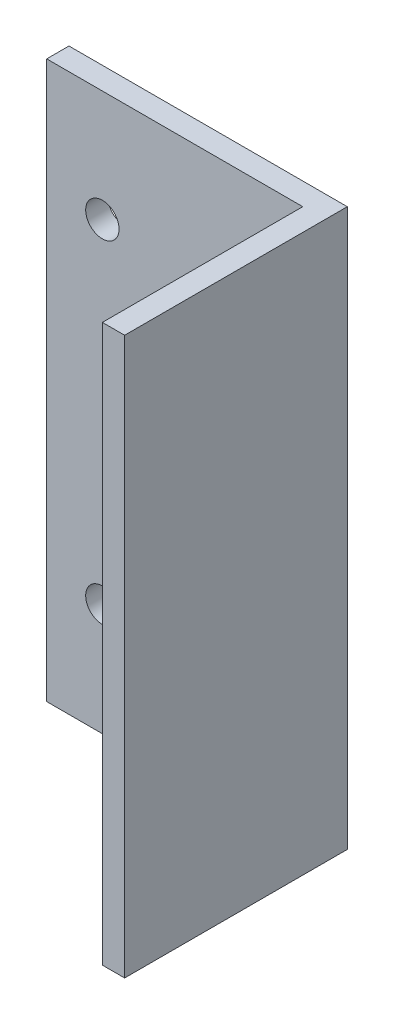
ISO-10303-21;
HEADER;
FILE_DESCRIPTION(('STEP AP214'),'2;1');
FILE_NAME('part.step','',(''),(''),'','','');
FILE_SCHEMA(('AUTOMOTIVE_DESIGN { 1 0 10303 214 1 1 1 1 }'));
ENDSEC;
DATA;
#1=APPLICATION_CONTEXT('core data for automotive mechanical design processes');
#2=APPLICATION_PROTOCOL_DEFINITION('international standard','automotive_design',2000,#1);
#3=PRODUCT_CONTEXT('',#1,'mechanical');
#4=PRODUCT('Part','Part','',(#3));
#5=PRODUCT_RELATED_PRODUCT_CATEGORY('part','',(#4));
#6=PRODUCT_DEFINITION_FORMATION('','',#4);
#7=PRODUCT_DEFINITION_CONTEXT('part definition',#1,'design');
#8=PRODUCT_DEFINITION('design','',#6,#7);
#9=PRODUCT_DEFINITION_SHAPE('','',#8);
#10=(LENGTH_UNIT() NAMED_UNIT(*) SI_UNIT(.MILLI.,.METRE.));
#11=(NAMED_UNIT(*) PLANE_ANGLE_UNIT() SI_UNIT($,.RADIAN.));
#12=(NAMED_UNIT(*) SI_UNIT($,.STERADIAN.) SOLID_ANGLE_UNIT());
#13=UNCERTAINTY_MEASURE_WITH_UNIT(LENGTH_MEASURE(1.E-05),#10,'distance_accuracy_value','');
#14=(GEOMETRIC_REPRESENTATION_CONTEXT(3) GLOBAL_UNCERTAINTY_ASSIGNED_CONTEXT((#13)) GLOBAL_UNIT_ASSIGNED_CONTEXT((#10,
#11,#12)) REPRESENTATION_CONTEXT('',''));
#15=CARTESIAN_POINT('',(0.,0.,0.));
#16=DIRECTION('',(0.,0.,1.));
#17=DIRECTION('',(1.,0.,0.));
#18=AXIS2_PLACEMENT_3D('',#15,#16,#17);
#19=CARTESIAN_POINT('',(0.,50.,2.));
#20=DIRECTION('',(1.,0.,0.));
#21=DIRECTION('',(0.,0.,-1.));
#22=AXIS2_PLACEMENT_3D('',#19,#20,#21);
#23=PLANE('',#22);
#24=DIRECTION('',(0.,0.,1.));
#25=VECTOR('',#24,1.);
#26=CARTESIAN_POINT('',(0.,0.,2.));
#27=LINE('',#26,#25);
#28=CARTESIAN_POINT('',(0.,0.,0.));
#29=VERTEX_POINT('',#28);
#30=CARTESIAN_POINT('',(0.,0.,2.));
#31=VERTEX_POINT('',#30);
#32=EDGE_CURVE('E117',#29,#31,#27,.T.);
#33=ORIENTED_EDGE('',*,*,#32,.T.);
#34=DIRECTION('',(0.,-1.,0.));
#35=VECTOR('',#34,1.);
#36=CARTESIAN_POINT('',(0.,50.,2.));
#37=LINE('',#36,#35);
#38=CARTESIAN_POINT('',(0.,50.,2.));
#39=VERTEX_POINT('',#38);
#40=EDGE_CURVE('E11',#39,#31,#37,.T.);
#41=ORIENTED_EDGE('',*,*,#40,.F.);
#42=DIRECTION('',(0.,0.,1.));
#43=VECTOR('',#42,1.);
#44=CARTESIAN_POINT('',(0.,50.,2.));
#45=LINE('',#44,#43);
#46=CARTESIAN_POINT('',(0.,50.,0.));
#47=VERTEX_POINT('',#46);
#48=EDGE_CURVE('E128',#47,#39,#45,.T.);
#49=ORIENTED_EDGE('',*,*,#48,.F.);
#50=DIRECTION('',(0.,-1.,0.));
#51=VECTOR('',#50,1.);
#52=CARTESIAN_POINT('',(0.,50.,0.));
#53=LINE('',#52,#51);
#54=EDGE_CURVE('E113',#47,#29,#53,.T.);
#55=ORIENTED_EDGE('',*,*,#54,.T.);
#56=EDGE_LOOP('',(#33,#41,#49,#55));
#57=FACE_BOUND('',#56,.T.);
#58=ADVANCED_FACE('F33',(#57),#23,.F.);
#59=CARTESIAN_POINT('',(23.,50.,2.));
#60=DIRECTION('',(0.,0.,-1.));
#61=DIRECTION('',(-1.,0.,0.));
#62=AXIS2_PLACEMENT_3D('',#59,#60,#61);
#63=PLANE('',#62);
#64=CARTESIAN_POINT('',(5.,10.,2.));
#65=DIRECTION('',(0.,0.,-1.));
#66=DIRECTION('',(-1.,0.,0.));
#67=AXIS2_PLACEMENT_3D('',#64,#65,#66);
#68=CIRCLE('',#67,1.5);
#69=CARTESIAN_POINT('',(3.5,10.,2.));
#70=VERTEX_POINT('',#69);
#71=EDGE_CURVE('E227',#70,#70,#68,.T.);
#72=ORIENTED_EDGE('',*,*,#71,.T.);
#73=EDGE_LOOP('',(#72));
#74=FACE_BOUND('',#73,.T.);
#75=CARTESIAN_POINT('',(5.,40.,2.));
#76=DIRECTION('',(0.,0.,-1.));
#77=DIRECTION('',(-1.,0.,0.));
#78=AXIS2_PLACEMENT_3D('',#75,#76,#77);
#79=CIRCLE('',#78,1.5);
#80=CARTESIAN_POINT('',(3.5,40.,2.));
#81=VERTEX_POINT('',#80);
#82=EDGE_CURVE('E121',#81,#81,#79,.T.);
#83=ORIENTED_EDGE('',*,*,#82,.T.);
#84=EDGE_LOOP('',(#83));
#85=FACE_BOUND('',#84,.T.);
#86=DIRECTION('',(1.,0.,0.));
#87=VECTOR('',#86,1.);
#88=CARTESIAN_POINT('',(23.,0.,2.));
#89=LINE('',#88,#87);
#90=CARTESIAN_POINT('',(23.,0.,2.));
#91=VERTEX_POINT('',#90);
#92=EDGE_CURVE('E120',#31,#91,#89,.T.);
#93=ORIENTED_EDGE('',*,*,#92,.T.);
#94=DIRECTION('',(0.,-1.,0.));
#95=VECTOR('',#94,1.);
#96=CARTESIAN_POINT('',(23.,50.,2.));
#97=LINE('',#96,#95);
#98=CARTESIAN_POINT('',(23.,50.,2.));
#99=VERTEX_POINT('',#98);
#100=EDGE_CURVE('E41',#99,#91,#97,.T.);
#101=ORIENTED_EDGE('',*,*,#100,.F.);
#102=DIRECTION('',(1.,0.,0.));
#103=VECTOR('',#102,1.);
#104=CARTESIAN_POINT('',(23.,50.,2.));
#105=LINE('',#104,#103);
#106=EDGE_CURVE('E86',#39,#99,#105,.T.);
#107=ORIENTED_EDGE('',*,*,#106,.F.);
#108=ORIENTED_EDGE('',*,*,#40,.T.);
#109=EDGE_LOOP('',(#93,#101,#107,#108));
#110=FACE_BOUND('',#109,.T.);
#111=ADVANCED_FACE('F155',(#74,#85,#110),#63,.F.);
#112=CARTESIAN_POINT('',(23.,50.,20.));
#113=DIRECTION('',(1.,0.,0.));
#114=DIRECTION('',(0.,0.,-1.));
#115=AXIS2_PLACEMENT_3D('',#112,#113,#114);
#116=PLANE('',#115);
#117=DIRECTION('',(0.,0.,1.));
#118=VECTOR('',#117,1.);
#119=CARTESIAN_POINT('',(23.,0.,20.));
#120=LINE('',#119,#118);
#121=CARTESIAN_POINT('',(23.,0.,20.));
#122=VERTEX_POINT('',#121);
#123=EDGE_CURVE('E123',#91,#122,#120,.T.);
#124=ORIENTED_EDGE('',*,*,#123,.T.);
#125=DIRECTION('',(0.,-1.,0.));
#126=VECTOR('',#125,1.);
#127=CARTESIAN_POINT('',(23.,50.,20.));
#128=LINE('',#127,#126);
#129=CARTESIAN_POINT('',(23.,50.,20.));
#130=VERTEX_POINT('',#129);
#131=EDGE_CURVE('E108',#130,#122,#128,.T.);
#132=ORIENTED_EDGE('',*,*,#131,.F.);
#133=DIRECTION('',(0.,0.,1.));
#134=VECTOR('',#133,1.);
#135=CARTESIAN_POINT('',(23.,50.,20.));
#136=LINE('',#135,#134);
#137=EDGE_CURVE('E99',#99,#130,#136,.T.);
#138=ORIENTED_EDGE('',*,*,#137,.F.);
#139=ORIENTED_EDGE('',*,*,#100,.T.);
#140=EDGE_LOOP('',(#124,#132,#138,#139));
#141=FACE_BOUND('',#140,.T.);
#142=ADVANCED_FACE('F134',(#141),#116,.F.);
#143=CARTESIAN_POINT('',(25.,50.,20.));
#144=DIRECTION('',(0.,0.,-1.));
#145=DIRECTION('',(-1.,0.,0.));
#146=AXIS2_PLACEMENT_3D('',#143,#144,#145);
#147=PLANE('',#146);
#148=DIRECTION('',(1.,0.,0.));
#149=VECTOR('',#148,1.);
#150=CARTESIAN_POINT('',(25.,0.,20.));
#151=LINE('',#150,#149);
#152=CARTESIAN_POINT('',(25.,0.,20.));
#153=VERTEX_POINT('',#152);
#154=EDGE_CURVE('E107',#122,#153,#151,.T.);
#155=ORIENTED_EDGE('',*,*,#154,.T.);
#156=DIRECTION('',(0.,-1.,0.));
#157=VECTOR('',#156,1.);
#158=CARTESIAN_POINT('',(25.,50.,20.));
#159=LINE('',#158,#157);
#160=CARTESIAN_POINT('',(25.,50.,20.));
#161=VERTEX_POINT('',#160);
#162=EDGE_CURVE('E104',#161,#153,#159,.T.);
#163=ORIENTED_EDGE('',*,*,#162,.F.);
#164=DIRECTION('',(1.,0.,0.));
#165=VECTOR('',#164,1.);
#166=CARTESIAN_POINT('',(25.,50.,20.));
#167=LINE('',#166,#165);
#168=EDGE_CURVE('E93',#130,#161,#167,.T.);
#169=ORIENTED_EDGE('',*,*,#168,.F.);
#170=ORIENTED_EDGE('',*,*,#131,.T.);
#171=EDGE_LOOP('',(#155,#163,#169,#170));
#172=FACE_BOUND('',#171,.T.);
#173=ADVANCED_FACE('F105',(#172),#147,.F.);
#174=CARTESIAN_POINT('',(25.,50.,0.));
#175=DIRECTION('',(-1.,0.,0.));
#176=DIRECTION('',(0.,0.,1.));
#177=AXIS2_PLACEMENT_3D('',#174,#175,#176);
#178=PLANE('',#177);
#179=DIRECTION('',(0.,0.,-1.));
#180=VECTOR('',#179,1.);
#181=CARTESIAN_POINT('',(25.,0.,0.));
#182=LINE('',#181,#180);
#183=CARTESIAN_POINT('',(25.,0.,0.));
#184=VERTEX_POINT('',#183);
#185=EDGE_CURVE('E72',#153,#184,#182,.T.);
#186=ORIENTED_EDGE('',*,*,#185,.T.);
#187=DIRECTION('',(0.,-1.,0.));
#188=VECTOR('',#187,1.);
#189=CARTESIAN_POINT('',(25.,50.,0.));
#190=LINE('',#189,#188);
#191=CARTESIAN_POINT('',(25.,50.,0.));
#192=VERTEX_POINT('',#191);
#193=EDGE_CURVE('E109',#192,#184,#190,.T.);
#194=ORIENTED_EDGE('',*,*,#193,.F.);
#195=DIRECTION('',(0.,0.,-1.));
#196=VECTOR('',#195,1.);
#197=CARTESIAN_POINT('',(25.,50.,0.));
#198=LINE('',#197,#196);
#199=EDGE_CURVE('E97',#161,#192,#198,.T.);
#200=ORIENTED_EDGE('',*,*,#199,.F.);
#201=ORIENTED_EDGE('',*,*,#162,.T.);
#202=EDGE_LOOP('',(#186,#194,#200,#201));
#203=FACE_BOUND('',#202,.T.);
#204=ADVANCED_FACE('F111',(#203),#178,.F.);
#205=CARTESIAN_POINT('',(0.,50.,0.));
#206=DIRECTION('',(0.,0.,1.));
#207=DIRECTION('',(1.,0.,0.));
#208=AXIS2_PLACEMENT_3D('',#205,#206,#207);
#209=PLANE('',#208);
#210=CARTESIAN_POINT('',(5.,10.,0.));
#211=DIRECTION('',(0.,0.,-1.));
#212=DIRECTION('',(1.,0.,0.));
#213=AXIS2_PLACEMENT_3D('',#210,#211,#212);
#214=CIRCLE('',#213,1.5);
#215=CARTESIAN_POINT('',(6.5,10.,0.));
#216=VERTEX_POINT('',#215);
#217=EDGE_CURVE('E225',#216,#216,#214,.T.);
#218=ORIENTED_EDGE('',*,*,#217,.F.);
#219=EDGE_LOOP('',(#218));
#220=FACE_BOUND('',#219,.T.);
#221=CARTESIAN_POINT('',(5.,40.,0.));
#222=DIRECTION('',(0.,0.,-1.));
#223=DIRECTION('',(-1.,0.,0.));
#224=AXIS2_PLACEMENT_3D('',#221,#222,#223);
#225=CIRCLE('',#224,1.5);
#226=CARTESIAN_POINT('',(3.5,40.,0.));
#227=VERTEX_POINT('',#226);
#228=EDGE_CURVE('E228',#227,#227,#225,.T.);
#229=ORIENTED_EDGE('',*,*,#228,.F.);
#230=EDGE_LOOP('',(#229));
#231=FACE_BOUND('',#230,.T.);
#232=DIRECTION('',(-1.,0.,0.));
#233=VECTOR('',#232,1.);
#234=CARTESIAN_POINT('',(0.,0.,0.));
#235=LINE('',#234,#233);
#236=EDGE_CURVE('E78',#184,#29,#235,.T.);
#237=ORIENTED_EDGE('',*,*,#236,.T.);
#238=ORIENTED_EDGE('',*,*,#54,.F.);
#239=DIRECTION('',(-1.,0.,0.));
#240=VECTOR('',#239,1.);
#241=CARTESIAN_POINT('',(0.,50.,0.));
#242=LINE('',#241,#240);
#243=EDGE_CURVE('E49',#192,#47,#242,.T.);
#244=ORIENTED_EDGE('',*,*,#243,.F.);
#245=ORIENTED_EDGE('',*,*,#193,.T.);
#246=EDGE_LOOP('',(#237,#238,#244,#245));
#247=FACE_BOUND('',#246,.T.);
#248=ADVANCED_FACE('F141',(#220,#231,#247),#209,.F.);
#249=CARTESIAN_POINT('',(0.,50.,0.));
#250=DIRECTION('',(0.,-1.,0.));
#251=DIRECTION('',(0.,0.,-1.));
#252=AXIS2_PLACEMENT_3D('',#249,#250,#251);
#253=PLANE('',#252);
#254=ORIENTED_EDGE('',*,*,#48,.T.);
#255=ORIENTED_EDGE('',*,*,#106,.T.);
#256=ORIENTED_EDGE('',*,*,#137,.T.);
#257=ORIENTED_EDGE('',*,*,#168,.T.);
#258=ORIENTED_EDGE('',*,*,#199,.T.);
#259=ORIENTED_EDGE('',*,*,#243,.T.);
#260=EDGE_LOOP('',(#254,#255,#256,#257,#258,#259));
#261=FACE_BOUND('',#260,.T.);
#262=ADVANCED_FACE('F95',(#261),#253,.F.);
#263=CARTESIAN_POINT('',(0.,0.,0.));
#264=DIRECTION('',(0.,-1.,0.));
#265=DIRECTION('',(0.,0.,-1.));
#266=AXIS2_PLACEMENT_3D('',#263,#264,#265);
#267=PLANE('',#266);
#268=ORIENTED_EDGE('',*,*,#32,.F.);
#269=ORIENTED_EDGE('',*,*,#236,.F.);
#270=ORIENTED_EDGE('',*,*,#185,.F.);
#271=ORIENTED_EDGE('',*,*,#154,.F.);
#272=ORIENTED_EDGE('',*,*,#123,.F.);
#273=ORIENTED_EDGE('',*,*,#92,.F.);
#274=EDGE_LOOP('',(#268,#269,#270,#271,#272,#273));
#275=FACE_BOUND('',#274,.T.);
#276=ADVANCED_FACE('F137',(#275),#267,.T.);
#277=CARTESIAN_POINT('',(5.,40.,20.));
#278=DIRECTION('',(0.,0.,-1.));
#279=DIRECTION('',(-1.,0.,0.));
#280=AXIS2_PLACEMENT_3D('',#277,#278,#279);
#281=CYLINDRICAL_SURFACE('',#280,1.5);
#282=ORIENTED_EDGE('',*,*,#228,.T.);
#283=EDGE_LOOP('',(#282));
#284=FACE_BOUND('',#283,.T.);
#285=ORIENTED_EDGE('',*,*,#82,.F.);
#286=EDGE_LOOP('',(#285));
#287=FACE_BOUND('',#286,.T.);
#288=ADVANCED_FACE('F191',(#284,#287),#281,.F.);
#289=CARTESIAN_POINT('',(5.,10.,20.));
#290=DIRECTION('',(0.,0.,-1.));
#291=DIRECTION('',(-1.,0.,0.));
#292=AXIS2_PLACEMENT_3D('',#289,#290,#291);
#293=CYLINDRICAL_SURFACE('',#292,1.5);
#294=ORIENTED_EDGE('',*,*,#217,.T.);
#295=EDGE_LOOP('',(#294));
#296=FACE_BOUND('',#295,.T.);
#297=ORIENTED_EDGE('',*,*,#71,.F.);
#298=EDGE_LOOP('',(#297));
#299=FACE_BOUND('',#298,.T.);
#300=ADVANCED_FACE('F209',(#296,#299),#293,.F.);
#301=CLOSED_SHELL('',(#58,#111,#142,#173,#204,#248,#262,#276,#288,#300));
#302=MANIFOLD_SOLID_BREP('B2',#301);
#303=ADVANCED_BREP_SHAPE_REPRESENTATION('',(#18,#302),#14);
#304=SHAPE_DEFINITION_REPRESENTATION(#9,#303);
ENDSEC;
END-ISO-10303-21;
